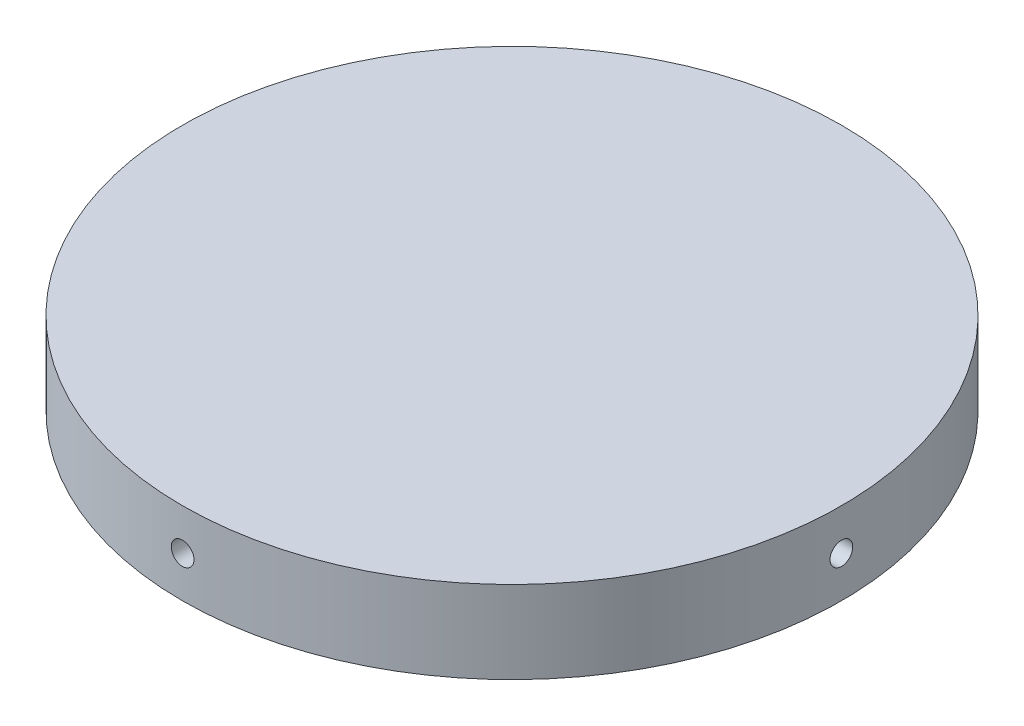
ISO-10303-21;
HEADER;
FILE_DESCRIPTION(('STEP AP214'),'2;1');
FILE_NAME('part.step','',(''),(''),'','','');
FILE_SCHEMA(('AUTOMOTIVE_DESIGN { 1 0 10303 214 1 1 1 1 }'));
ENDSEC;
DATA;
#1=APPLICATION_CONTEXT('core data for automotive mechanical design processes');
#2=APPLICATION_PROTOCOL_DEFINITION('international standard','automotive_design',2000,#1);
#3=PRODUCT_CONTEXT('',#1,'mechanical');
#4=PRODUCT('Part','Part','',(#3));
#5=PRODUCT_RELATED_PRODUCT_CATEGORY('part','',(#4));
#6=PRODUCT_DEFINITION_FORMATION('','',#4);
#7=PRODUCT_DEFINITION_CONTEXT('part definition',#1,'design');
#8=PRODUCT_DEFINITION('design','',#6,#7);
#9=PRODUCT_DEFINITION_SHAPE('','',#8);
#10=(LENGTH_UNIT() NAMED_UNIT(*) SI_UNIT(.MILLI.,.METRE.));
#11=(NAMED_UNIT(*) PLANE_ANGLE_UNIT() SI_UNIT($,.RADIAN.));
#12=(NAMED_UNIT(*) SI_UNIT($,.STERADIAN.) SOLID_ANGLE_UNIT());
#13=UNCERTAINTY_MEASURE_WITH_UNIT(LENGTH_MEASURE(1.E-05),#10,'distance_accuracy_value','');
#14=(GEOMETRIC_REPRESENTATION_CONTEXT(3) GLOBAL_UNCERTAINTY_ASSIGNED_CONTEXT((#13)) GLOBAL_UNIT_ASSIGNED_CONTEXT((#10,
#11,#12)) REPRESENTATION_CONTEXT('',''));
#15=CARTESIAN_POINT('',(0.,0.,0.));
#16=DIRECTION('',(0.,0.,1.));
#17=DIRECTION('',(1.,0.,0.));
#18=AXIS2_PLACEMENT_3D('',#15,#16,#17);
#19=CARTESIAN_POINT('',(0.,12.7,0.));
#20=DIRECTION('',(0.,-1.,0.));
#21=DIRECTION('',(0.,0.,-1.));
#22=AXIS2_PLACEMENT_3D('',#19,#20,#21);
#23=CYLINDRICAL_SURFACE('',#22,50.8);
#24=CARTESIAN_POINT('',(50.7697586486286,6.35,-1.75260000000018));
#25=CARTESIAN_POINT('',(50.7697590563509,6.25158712369945,-1.75259564543816));
#26=CARTESIAN_POINT('',(50.7700478702747,6.15310363437709,-1.74428297929298));
#27=CARTESIAN_POINT('',(50.7711721845594,5.95885109882344,-1.71123866624466));
#28=CARTESIAN_POINT('',(50.7720083363126,5.8630854289641,-1.68648745514505));
#29=CARTESIAN_POINT('',(50.7741324957903,5.67711073668785,-1.6212734359192));
#30=CARTESIAN_POINT('',(50.7754202807472,5.58689900053991,-1.58081837265326));
#31=CARTESIAN_POINT('',(50.778302314984,5.4145721996251,-1.48535627271692));
#32=CARTESIAN_POINT('',(50.7798964898759,5.33245517685738,-1.4303527670313));
#33=CARTESIAN_POINT('',(50.7832127031895,5.17857794030629,-1.30731978963743));
#34=CARTESIAN_POINT('',(50.7849348021763,5.10682268018734,-1.23928412354495));
#35=CARTESIAN_POINT('',(50.7883122209499,4.9757476927813,-1.09212943641594));
#36=CARTESIAN_POINT('',(50.7899675380634,4.91642846294045,-1.01300997223412));
#37=CARTESIAN_POINT('',(50.7930251641414,4.81189972119783,-0.845912742481277));
#38=CARTESIAN_POINT('',(50.7944274146147,4.76669346946469,-0.757932936325698));
#39=CARTESIAN_POINT('',(50.7968203288865,4.69169503014048,-0.575626931287873));
#40=CARTESIAN_POINT('',(50.7978109946004,4.66190277081711,-0.481300761942098));
#41=CARTESIAN_POINT('',(50.7992687193491,4.61858945193518,-0.289019692747369));
#42=CARTESIAN_POINT('',(50.7997359884024,4.60506186584441,-0.191066264685456));
#43=CARTESIAN_POINT('',(50.8000949541903,4.59464177479241,0.00572216138129752));
#44=CARTESIAN_POINT('',(50.7999866536264,4.59774919174994,0.104557155246079));
#45=CARTESIAN_POINT('',(50.7992068664176,4.62050541754115,0.300258946196319));
#46=CARTESIAN_POINT('',(50.798535619427,4.6401471874755,0.397126562852503));
#47=CARTESIAN_POINT('',(50.79670585879,4.69540366652185,0.586188739561539));
#48=CARTESIAN_POINT('',(50.7955473438949,4.73101841656027,0.678383287640246));
#49=CARTESIAN_POINT('',(50.7928731919409,4.81721794986243,0.855504921624031));
#50=CARTESIAN_POINT('',(50.7913574780237,4.86780595550809,0.940430438089782));
#51=CARTESIAN_POINT('',(50.7881397227175,4.9825136079501,1.10058608550572));
#52=CARTESIAN_POINT('',(50.7864376807411,5.04663329740408,1.17581618589063));
#53=CARTESIAN_POINT('',(50.7830380115152,5.18662402673944,1.3144865293823));
#54=CARTESIAN_POINT('',(50.7813403870287,5.262501173579,1.37792060761355));
#55=CARTESIAN_POINT('',(50.7781418359447,5.42383141876462,1.49115077723215));
#56=CARTESIAN_POINT('',(50.7766409093824,5.50928451882575,1.5409468661769));
#57=CARTESIAN_POINT('',(50.774005062609,5.6873444795598,1.62548688040663));
#58=CARTESIAN_POINT('',(50.7728701473992,5.77995143796312,1.66023060001506));
#59=CARTESIAN_POINT('',(50.7710945021759,5.96968874584344,1.71367563160475));
#60=CARTESIAN_POINT('',(50.7704537703865,6.06681907906316,1.73237700123849));
#61=CARTESIAN_POINT('',(50.7697390631889,6.26279230781476,1.75319889347741));
#62=CARTESIAN_POINT('',(50.7696647957442,6.36163429456887,1.75532795982281));
#63=CARTESIAN_POINT('',(50.7700906295787,6.55827218389549,1.74296707929653));
#64=CARTESIAN_POINT('',(50.7705907299688,6.65606808808686,1.72847715814716));
#65=CARTESIAN_POINT('',(50.7721086588272,6.84781386924622,1.68329669707876));
#66=CARTESIAN_POINT('',(50.7731263630513,6.94176466333795,1.65261004490675));
#67=CARTESIAN_POINT('',(50.7755646720241,7.12318147652574,1.57591114524661));
#68=CARTESIAN_POINT('',(50.7769852778606,7.2106474781122,1.52989885637955));
#69=CARTESIAN_POINT('',(50.7800699634245,7.37665120820319,1.42383280209292));
#70=CARTESIAN_POINT('',(50.7817341427782,7.45518525990083,1.36377328505018));
#71=CARTESIAN_POINT('',(50.7851180250531,7.60105885186234,1.23132608217642));
#72=CARTESIAN_POINT('',(50.7868377281547,7.66839835577453,1.15893835631397));
#73=CARTESIAN_POINT('',(50.7901396523594,7.78999987720908,1.00385294890715));
#74=CARTESIAN_POINT('',(50.7917218153481,7.84425638380701,0.921150944877202));
#75=CARTESIAN_POINT('',(50.7945694877666,7.9381140932631,0.747806598646796));
#76=CARTESIAN_POINT('',(50.7958349980311,7.97771533475438,0.657164277378781));
#77=CARTESIAN_POINT('',(50.797906437117,8.04112871529301,0.470533027739396));
#78=CARTESIAN_POINT('',(50.7987124696127,8.06494441631075,0.37454531084691));
#79=CARTESIAN_POINT('',(50.7997745080026,8.09612235280169,0.179930892200068));
#80=CARTESIAN_POINT('',(50.8000305148536,8.10348461689812,0.0813041950369192));
#81=CARTESIAN_POINT('',(50.7999636515915,8.10154629052573,-0.115733551471626));
#82=CARTESIAN_POINT('',(50.7996410827598,8.09225437238121,-0.214144686350581));
#83=CARTESIAN_POINT('',(50.7984540004404,8.05728930389731,-0.408009205743081));
#84=CARTESIAN_POINT('',(50.7975894858873,8.03161612135555,-0.503462584441867));
#85=CARTESIAN_POINT('',(50.795415868083,7.9646186839361,-0.688704831817265));
#86=CARTESIAN_POINT('',(50.7941067579118,7.92329418544868,-0.778493612300114));
#87=CARTESIAN_POINT('',(50.7911914024654,7.82616959827039,-0.949857530207175));
#88=CARTESIAN_POINT('',(50.7895851676408,7.77037001866973,-1.03143295635594));
#89=CARTESIAN_POINT('',(50.7862556251448,7.64585158366056,-1.18409570495988));
#90=CARTESIAN_POINT('',(50.7845322692961,7.57712739097823,-1.25517867278727));
#91=CARTESIAN_POINT('',(50.7811628093207,7.42870084094923,-1.38481814627652));
#92=CARTESIAN_POINT('',(50.7795167244055,7.34899577264919,-1.44337154950296));
#93=CARTESIAN_POINT('',(50.776486775378,7.18083314968626,-1.54630287522696));
#94=CARTESIAN_POINT('',(50.7751030967528,7.09236947056442,-1.59067078551648));
#95=CARTESIAN_POINT('',(50.7727572810387,6.90931187956018,-1.66387261434713));
#96=CARTESIAN_POINT('',(50.7717946423914,6.81472541648413,-1.69272502498622));
#97=CARTESIAN_POINT('',(50.7706563408481,6.65795268143263,-1.72644481694736));
#98=CARTESIAN_POINT('',(50.7703211727805,6.59678362086623,-1.73624063654658));
#99=CARTESIAN_POINT('',(50.7698721985096,6.47375234900876,-1.74931959604606));
#100=CARTESIAN_POINT('',(50.7697583922192,6.41189013799036,-1.75260273850813));
#101=CARTESIAN_POINT('',(50.7697586486286,6.35,-1.75260000000018));
#102=B_SPLINE_CURVE_WITH_KNOTS('',3,(#24,#25,#26,#27,#28,#29,#30,#31,#32,#33,#34,#35,#36,#37,
#38,#39,#40,#41,#42,#43,#44,#45,#46,#47,#48,#49,#50,#51,#52,#53,#54,#55,#56,#57,#58,#59,#60,#61,
#62,#63,#64,#65,#66,#67,#68,#69,#70,#71,#72,#73,#74,#75,#76,#77,#78,#79,#80,#81,#82,#83,#84,#85,
#86,#87,#88,#89,#90,#91,#92,#93,#94,#95,#96,#97,#98,#99,#100,#101),.UNSPECIFIED.,.T.,.F.,(4,2,2,
2,2,2,2,2,2,2,2,2,2,2,2,2,2,2,2,2,2,2,2,2,2,2,2,2,2,2,2,2,2,2,2,2,2,2,4),(0.,0.295012718980966,
0.590377175561222,0.88559614834363,1.1807435355453,1.47603156047932,1.77133139480085,
2.06669939447319,2.36206601957486,2.65731408318958,2.95256076097259,3.24768181174946,
3.54280361869841,3.83798898480409,4.13317528147352,4.42851541843866,4.72385560830018,
5.01919983358211,5.31454299746121,5.60973388905447,5.90492432376197,6.20004393527856,
6.49516434361926,6.79040580090399,7.08564821689796,7.38101478085389,7.67638056618114,
7.97167968019765,8.26697828049624,8.56212315476916,8.85726860924116,9.15241865778436,
9.44755832727452,9.74282014463666,10.0381549871587,10.3336978210068,10.6288876279762,
10.8144160441254,10.9999443872955),.UNSPECIFIED.);
#103=CARTESIAN_POINT('',(50.7697586486286,6.35,-1.75260000000018));
#104=VERTEX_POINT('',#103);
#105=EDGE_CURVE('E10',#104,#104,#102,.T.);
#106=ORIENTED_EDGE('',*,*,#105,.T.);
#107=EDGE_LOOP('',(#106));
#108=FACE_BOUND('',#107,.T.);
#109=CARTESIAN_POINT('',(0.,8.1026,-50.8));
#110=CARTESIAN_POINT('',(-0.0984128959565782,8.10259564545586,-50.7999995931979));
#111=CARTESIAN_POINT('',(-0.196896404867266,8.09428297610245,-50.799710955742));
#112=CARTESIAN_POINT('',(-0.391148981122014,8.06123864915159,-50.7985872715938));
#113=CARTESIAN_POINT('',(-0.48691467210945,8.036487427424,-50.7977515738417));
#114=CARTESIAN_POINT('',(-0.672889409044617,7.97127337710194,-50.7956283999256));
#115=CARTESIAN_POINT('',(-0.763101168544404,7.93081829286039,-50.7943411464762));
#116=CARTESIAN_POINT('',(-0.935428008517312,7.83535614354203,-50.7914600199745));
#117=CARTESIAN_POINT('',(-1.01754504702097,7.78035260950216,-50.7898662213488));
#118=CARTESIAN_POINT('',(-1.1714222655228,7.65731960358333,-50.7865504417537));
#119=CARTESIAN_POINT('',(-1.2431774969079,7.58928394364306,-50.7848284001287));
#120=CARTESIAN_POINT('',(-1.37425242893701,7.44212928084566,-50.7814507509568));
#121=CARTESIAN_POINT('',(-1.4335716320468,7.36300983476529,-50.77979514607));
#122=CARTESIAN_POINT('',(-1.538100346055,7.19591262059332,-50.7767367249013));
#123=CARTESIAN_POINT('',(-1.58330659181438,7.10793280880709,-50.7753339671492));
#124=CARTESIAN_POINT('',(-1.65830501853675,6.92562679152479,-50.7729400417122));
#125=CARTESIAN_POINT('',(-1.68809727130477,6.83130061559515,-50.77194887211));
#126=CARTESIAN_POINT('',(-1.73141057616485,6.63901952737372,-50.7704903642857));
#127=CARTESIAN_POINT('',(-1.74493815432662,6.54106608676581,-50.77002281597));
#128=CARTESIAN_POINT('',(-1.75535822517484,6.34427763621804,-50.7696636384962));
#129=CARTESIAN_POINT('',(-1.75225079602588,6.24544263042267,-50.7697720066319));
#130=CARTESIAN_POINT('',(-1.72949455116915,6.04974089387287,-50.7705522460495));
#131=CARTESIAN_POINT('',(-1.70985278662663,5.95287334211728,-50.771223877124));
#132=CARTESIAN_POINT('',(-1.65459634095298,5.76381129243322,-50.7730545539207));
#133=CARTESIAN_POINT('',(-1.61898161877555,5.67161680651399,-50.7742136008955));
#134=CARTESIAN_POINT('',(-1.53278214267062,5.49449524695994,-50.7768887327971));
#135=CARTESIAN_POINT('',(-1.48219415977972,5.40956974596971,-50.7784048947208));
#136=CARTESIAN_POINT('',(-1.36748655564144,5.24941411980763,-50.78162326513));
#137=CARTESIAN_POINT('',(-1.3033668917511,5.17418402519053,-50.7833254742018));
#138=CARTESIAN_POINT('',(-1.1633761802604,5.03551365194251,-50.7867251244156));
#139=CARTESIAN_POINT('',(-1.08749902055746,4.97207954337325,-50.7884225626076));
#140=CARTESIAN_POINT('',(-0.926168738931161,4.85884931871537,-50.791620468291));
#141=CARTESIAN_POINT('',(-0.840715615335229,4.80905320500883,-50.7931209357481));
#142=CARTESIAN_POINT('',(-0.662655648845048,4.72451317306927,-50.7957557921781));
#143=CARTESIAN_POINT('',(-0.5700487119044,4.68976945275971,-50.7968901763374));
#144=CARTESIAN_POINT('',(-0.380311450581766,4.63632441316367,-50.7986649211309));
#145=CARTESIAN_POINT('',(-0.283181142421377,4.61762303635123,-50.7993052835366));
#146=CARTESIAN_POINT('',(-0.0872079243355516,4.59680111713785,-50.8000195761506));
#147=CARTESIAN_POINT('',(0.0116340775398622,4.5946720378379,-50.8000937979947));
#148=CARTESIAN_POINT('',(0.20827200024276,4.60703289785515,-50.7996682160819));
#149=CARTESIAN_POINT('',(0.306067922689191,4.62152281144849,-50.7991684132135));
#150=CARTESIAN_POINT('',(0.497813789647892,4.66670327559961,-50.7976512918862));
#151=CARTESIAN_POINT('',(0.591764649486023,4.69738994602561,-50.7966340973771));
#152=CARTESIAN_POINT('',(0.773181586062896,4.77408890427423,-50.7941967968346));
#153=CARTESIAN_POINT('',(0.860647645337104,4.82010123336929,-50.7927766897161));
#154=CARTESIAN_POINT('',(1.02665141320237,4.92616734599295,-50.7896927736392));
#155=CARTESIAN_POINT('',(1.10518545152865,4.98622687090682,-50.788028865138));
#156=CARTESIAN_POINT('',(1.25105901283208,5.11867408201043,-50.7846451768049));
#157=CARTESIAN_POINT('',(1.31839849940078,5.1910618082941,-50.7829253967913));
#158=CARTESIAN_POINT('',(1.43999998553517,5.34614720782146,-50.7796230047163));
#159=CARTESIAN_POINT('',(1.49425647418964,5.42884920353655,-50.7780404506373));
#160=CARTESIAN_POINT('',(1.58811415211509,5.60219352855812,-50.775191853083));
#161=CARTESIAN_POINT('',(1.62771538001911,5.6928358369322,-50.7739258087735));
#162=CARTESIAN_POINT('',(1.69112875107789,5.87946709648122,-50.7718533926797));
#163=CARTESIAN_POINT('',(1.71494445033061,5.97545483817391,-50.7710469173715));
#164=CARTESIAN_POINT('',(1.74612237488034,6.17006930894842,-50.7699842791192));
#165=CARTESIAN_POINT('',(1.75348462893165,6.268696033418,-50.7697281152135));
#166=CARTESIAN_POINT('',(1.75154627419168,6.46573376092397,-50.7697950192215));
#167=CARTESIAN_POINT('',(1.74225434965268,6.5641448496131,-50.7701177852547));
#168=CARTESIAN_POINT('',(1.70728928467348,6.75800927508585,-50.7713055292118));
#169=CARTESIAN_POINT('',(1.68161611194781,6.8534626060397,-50.7721705082042));
#170=CARTESIAN_POINT('',(1.61461871113359,7.03870476103204,-50.7743451188269));
#171=CARTESIAN_POINT('',(1.57329423938889,7.12849349685992,-50.7756547573795));
#172=CARTESIAN_POINT('',(1.47616971944185,7.29985733668389,-50.7785710019698));
#173=CARTESIAN_POINT('',(1.42037018028169,7.38143272937719,-50.7801775975638));
#174=CARTESIAN_POINT('',(1.29585178871437,7.53409548241012,-50.7835075374625));
#175=CARTESIAN_POINT('',(1.22712758986066,7.60517848064278,-50.7852309298923));
#176=CARTESIAN_POINT('',(1.07870101512548,7.73481801258338,-50.7886001214114));
#177=CARTESIAN_POINT('',(0.998995928356096,7.79337144393392,-50.790245901205));
#178=CARTESIAN_POINT('',(0.830833291411807,7.89630279875081,-50.7932750311959));
#179=CARTESIAN_POINT('',(0.742369620058934,7.94067071537748,-50.7946581958595));
#180=CARTESIAN_POINT('',(0.559312045732336,8.0138725582322,-50.797003001926));
#181=CARTESIAN_POINT('',(0.464725591522505,8.04272497645661,-50.7979651448636));
#182=CARTESIAN_POINT('',(0.307952836064301,8.07644479054058,-50.7991028291222));
#183=CARTESIAN_POINT('',(0.246783744663286,8.08624062007191,-50.7994378050103));
#184=CARTESIAN_POINT('',(0.12375241098076,8.09931959277201,-50.7998865183212));
#185=CARTESIAN_POINT('',(0.0618901689713733,8.10260273849753,-50.8000002558308));
#186=CARTESIAN_POINT('',(0.,8.1026,-50.8));
#187=B_SPLINE_CURVE_WITH_KNOTS('',3,(#109,#110,#111,#112,#113,#114,#115,#116,#117,#118,#119,
#120,#121,#122,#123,#124,#125,#126,#127,#128,#129,#130,#131,#132,#133,#134,#135,#136,#137,#138,
#139,#140,#141,#142,#143,#144,#145,#146,#147,#148,#149,#150,#151,#152,#153,#154,#155,#156,#157,
#158,#159,#160,#161,#162,#163,#164,#165,#166,#167,#168,#169,#170,#171,#172,#173,#174,#175,#176,
#177,#178,#179,#180,#181,#182,#183,#184,#185,#186),.UNSPECIFIED.,.T.,.F.,(4,2,2,2,2,2,2,2,2,2,2,
2,2,2,2,2,2,2,2,2,2,2,2,2,2,2,2,2,2,2,2,2,2,2,2,2,2,2,4),(0.,0.295012778010638,0.59037729233706,
0.885596332451623,1.18074378594895,1.47603173366953,1.77133149286483,2.06669952134063,
2.36206617385231,2.65731427328077,2.95256098539832,3.24768185155589,3.54280347610102,
3.83798878965154,4.13317503344603,4.42851524703345,4.72385551220625,5.019199660681,
5.31454275008169,5.60973368911843,5.90492417124168,6.20004396893928,6.49516456140956,
6.79040598733273,7.08564837346162,7.38101490723678,7.6763806623843,7.9716798561328,
8.26697853381107,8.56212327401551,8.85726859591654,9.15241851276689,9.44755805153782,
9.74281994807331,10.0381548679406,10.3336976675934,10.6288874423235,10.8144159512669,
10.999944387376),.UNSPECIFIED.);
#188=CARTESIAN_POINT('',(0.,8.1026,-50.8));
#189=VERTEX_POINT('',#188);
#190=EDGE_CURVE('E48',#189,#189,#187,.T.);
#191=ORIENTED_EDGE('',*,*,#190,.T.);
#192=EDGE_LOOP('',(#191));
#193=FACE_BOUND('',#192,.T.);
#194=CARTESIAN_POINT('',(-50.7697586486286,6.35,1.75260000000053));
#195=CARTESIAN_POINT('',(-50.7697590563509,6.25158712369945,1.75259564543851));
#196=CARTESIAN_POINT('',(-50.7700478702747,6.15310363437709,1.74428297929334));
#197=CARTESIAN_POINT('',(-50.7711721845594,5.95885109882344,1.71123866624502));
#198=CARTESIAN_POINT('',(-50.7720083363126,5.8630854289641,1.68648745514541));
#199=CARTESIAN_POINT('',(-50.7741324957903,5.67711073668785,1.62127343591955));
#200=CARTESIAN_POINT('',(-50.7754202807472,5.58689900053991,1.58081837265361));
#201=CARTESIAN_POINT('',(-50.778302314984,5.4145721996251,1.48535627271727));
#202=CARTESIAN_POINT('',(-50.7798964898759,5.33245517685738,1.43035276703165));
#203=CARTESIAN_POINT('',(-50.7832127031895,5.17857794030629,1.30731978963779));
#204=CARTESIAN_POINT('',(-50.7849348021762,5.10682268018734,1.2392841235453));
#205=CARTESIAN_POINT('',(-50.7883122209499,4.9757476927813,1.0921294364163));
#206=CARTESIAN_POINT('',(-50.7899675380634,4.91642846294045,1.01300997223447));
#207=CARTESIAN_POINT('',(-50.7930251641414,4.81189972119783,0.845912742481632));
#208=CARTESIAN_POINT('',(-50.7944274146147,4.76669346946469,0.757932936326053));
#209=CARTESIAN_POINT('',(-50.7968203288865,4.69169503014048,0.575626931288229));
#210=CARTESIAN_POINT('',(-50.7978109946004,4.66190277081711,0.481300761942454));
#211=CARTESIAN_POINT('',(-50.7992687193491,4.61858945193518,0.289019692747725));
#212=CARTESIAN_POINT('',(-50.7997359884024,4.60506186584441,0.191066264685812));
#213=CARTESIAN_POINT('',(-50.8000949541903,4.59464177479241,-0.00572216138094226));
#214=CARTESIAN_POINT('',(-50.7999866536264,4.59774919174994,-0.104557155245724));
#215=CARTESIAN_POINT('',(-50.7992068664176,4.62050541754115,-0.300258946195964));
#216=CARTESIAN_POINT('',(-50.798535619427,4.6401471874755,-0.397126562852148));
#217=CARTESIAN_POINT('',(-50.79670585879,4.69540366652185,-0.586188739561184));
#218=CARTESIAN_POINT('',(-50.7955473438949,4.73101841656027,-0.678383287639891));
#219=CARTESIAN_POINT('',(-50.7928731919409,4.81721794986243,-0.855504921623675));
#220=CARTESIAN_POINT('',(-50.7913574780237,4.86780595550809,-0.940430438089427));
#221=CARTESIAN_POINT('',(-50.7881397227175,4.9825136079501,-1.10058608550537));
#222=CARTESIAN_POINT('',(-50.7864376807411,5.04663329740408,-1.17581618589027));
#223=CARTESIAN_POINT('',(-50.7830380115152,5.18662402673944,-1.31448652938195));
#224=CARTESIAN_POINT('',(-50.7813403870287,5.262501173579,-1.37792060761319));
#225=CARTESIAN_POINT('',(-50.7781418359447,5.42383141876462,-1.4911507772318));
#226=CARTESIAN_POINT('',(-50.7766409093824,5.50928451882575,-1.54094686617655));
#227=CARTESIAN_POINT('',(-50.7740050626091,5.68734447955979,-1.62548688040628));
#228=CARTESIAN_POINT('',(-50.7728701473992,5.77995143796312,-1.6602306000147));
#229=CARTESIAN_POINT('',(-50.771094502176,5.96968874584345,-1.7136756316044));
#230=CARTESIAN_POINT('',(-50.7704537703865,6.06681907906316,-1.73237700123814));
#231=CARTESIAN_POINT('',(-50.7697390631889,6.26279230781476,-1.75319889347706));
#232=CARTESIAN_POINT('',(-50.7696647957442,6.36163429456886,-1.75532795982245));
#233=CARTESIAN_POINT('',(-50.7700906295787,6.55827218389549,-1.74296707929618));
#234=CARTESIAN_POINT('',(-50.7705907299688,6.65606808808686,-1.72847715814681));
#235=CARTESIAN_POINT('',(-50.7721086588272,6.84781386924622,-1.68329669707841));
#236=CARTESIAN_POINT('',(-50.7731263630513,6.94176466333795,-1.65261004490639));
#237=CARTESIAN_POINT('',(-50.7755646720241,7.12318147652574,-1.57591114524626));
#238=CARTESIAN_POINT('',(-50.7769852778606,7.2106474781122,-1.5298988563792));
#239=CARTESIAN_POINT('',(-50.7800699634245,7.37665120820319,-1.42383280209257));
#240=CARTESIAN_POINT('',(-50.7817341427782,7.45518525990083,-1.36377328504982));
#241=CARTESIAN_POINT('',(-50.7851180250531,7.60105885186234,-1.23132608217607));
#242=CARTESIAN_POINT('',(-50.7868377281547,7.66839835577453,-1.15893835631361));
#243=CARTESIAN_POINT('',(-50.7901396523595,7.78999987720908,-1.00385294890679));
#244=CARTESIAN_POINT('',(-50.7917218153481,7.84425638380701,-0.921150944876847));
#245=CARTESIAN_POINT('',(-50.7945694877666,7.9381140932631,-0.747806598646442));
#246=CARTESIAN_POINT('',(-50.7958349980311,7.97771533475438,-0.657164277378426));
#247=CARTESIAN_POINT('',(-50.797906437117,8.04112871529301,-0.470533027739042));
#248=CARTESIAN_POINT('',(-50.7987124696127,8.06494441631075,-0.374545310846556));
#249=CARTESIAN_POINT('',(-50.7997745080026,8.09612235280169,-0.179930892199714));
#250=CARTESIAN_POINT('',(-50.8000305148536,8.10348461689812,-0.0813041950365646));
#251=CARTESIAN_POINT('',(-50.7999636515915,8.10154629052573,0.115733551471981));
#252=CARTESIAN_POINT('',(-50.7996410827598,8.09225437238121,0.214144686350936));
#253=CARTESIAN_POINT('',(-50.7984540004404,8.05728930389731,0.408009205743436));
#254=CARTESIAN_POINT('',(-50.7975894858873,8.03161612135555,0.503462584442222));
#255=CARTESIAN_POINT('',(-50.795415868083,7.9646186839361,0.68870483181762));
#256=CARTESIAN_POINT('',(-50.7941067579118,7.92329418544868,0.77849361230047));
#257=CARTESIAN_POINT('',(-50.7911914024654,7.82616959827039,0.949857530207531));
#258=CARTESIAN_POINT('',(-50.7895851676408,7.77037001866973,1.03143295635629));
#259=CARTESIAN_POINT('',(-50.7862556251447,7.64585158366056,1.18409570496023));
#260=CARTESIAN_POINT('',(-50.7845322692961,7.57712739097823,1.25517867278762));
#261=CARTESIAN_POINT('',(-50.7811628093207,7.42870084094923,1.38481814627688));
#262=CARTESIAN_POINT('',(-50.7795167244055,7.34899577264919,1.44337154950332));
#263=CARTESIAN_POINT('',(-50.776486775378,7.18083314968625,1.54630287522732));
#264=CARTESIAN_POINT('',(-50.7751030967528,7.09236947056442,1.59067078551684));
#265=CARTESIAN_POINT('',(-50.7727572810387,6.90931187956018,1.66387261434748));
#266=CARTESIAN_POINT('',(-50.7717946423914,6.81472541648413,1.69272502498658));
#267=CARTESIAN_POINT('',(-50.7706563408481,6.65795268143263,1.72644481694771));
#268=CARTESIAN_POINT('',(-50.7703211727805,6.59678362086623,1.73624063654694));
#269=CARTESIAN_POINT('',(-50.7698721985095,6.47375234900876,1.74931959604641));
#270=CARTESIAN_POINT('',(-50.7697583922192,6.41189013799036,1.75260273850848));
#271=CARTESIAN_POINT('',(-50.7697586486286,6.35,1.75260000000053));
#272=B_SPLINE_CURVE_WITH_KNOTS('',3,(#194,#195,#196,#197,#198,#199,#200,#201,#202,#203,#204,
#205,#206,#207,#208,#209,#210,#211,#212,#213,#214,#215,#216,#217,#218,#219,#220,#221,#222,#223,
#224,#225,#226,#227,#228,#229,#230,#231,#232,#233,#234,#235,#236,#237,#238,#239,#240,#241,#242,
#243,#244,#245,#246,#247,#248,#249,#250,#251,#252,#253,#254,#255,#256,#257,#258,#259,#260,#261,
#262,#263,#264,#265,#266,#267,#268,#269,#270,#271),.UNSPECIFIED.,.T.,.F.,(4,2,2,2,2,2,2,2,2,2,2,
2,2,2,2,2,2,2,2,2,2,2,2,2,2,2,2,2,2,2,2,2,2,2,2,2,2,2,4),(0.,0.295012718980966,
0.590377175561222,0.88559614834363,1.1807435355453,1.47603156047932,1.77133139480085,
2.06669939447318,2.36206601957486,2.65731408318958,2.95256076097259,3.24768181174946,
3.54280361869841,3.83798898480409,4.13317528147352,4.42851541843866,4.72385560830018,
5.01919983358211,5.31454299746121,5.60973388905447,5.90492432376197,6.20004393527857,
6.49516434361926,6.79040580090399,7.08564821689796,7.38101478085389,7.67638056618114,
7.97167968019765,8.26697828049624,8.56212315476916,8.85726860924117,9.15241865778437,
9.44755832727452,9.74282014463666,10.0381549871587,10.3336978210068,10.6288876279762,
10.8144160441254,10.9999443872955),.UNSPECIFIED.);
#273=CARTESIAN_POINT('',(-50.7697586486286,6.35,1.75260000000053));
#274=VERTEX_POINT('',#273);
#275=EDGE_CURVE('E53',#274,#274,#272,.T.);
#276=ORIENTED_EDGE('',*,*,#275,.T.);
#277=EDGE_LOOP('',(#276));
#278=FACE_BOUND('',#277,.T.);
#279=CARTESIAN_POINT('',(1.7526,6.35,50.7697586486286));
#280=CARTESIAN_POINT('',(1.75259564543798,6.25158712369945,50.7697590563509));
#281=CARTESIAN_POINT('',(1.7442829792928,6.15310363437709,50.7700478702747));
#282=CARTESIAN_POINT('',(1.71123866624449,5.95885109882344,50.7711721845594));
#283=CARTESIAN_POINT('',(1.68648745514488,5.8630854289641,50.7720083363126));
#284=CARTESIAN_POINT('',(1.62127343591902,5.67711073668785,50.7741324957903));
#285=CARTESIAN_POINT('',(1.58081837265308,5.58689900053991,50.7754202807472));
#286=CARTESIAN_POINT('',(1.48535627271674,5.4145721996251,50.778302314984));
#287=CARTESIAN_POINT('',(1.43035276703112,5.33245517685738,50.7798964898759));
#288=CARTESIAN_POINT('',(1.30731978963726,5.17857794030629,50.7832127031895));
#289=CARTESIAN_POINT('',(1.23928412354477,5.10682268018734,50.7849348021763));
#290=CARTESIAN_POINT('',(1.09212943641576,4.9757476927813,50.7883122209499));
#291=CARTESIAN_POINT('',(1.01300997223394,4.91642846294045,50.7899675380634));
#292=CARTESIAN_POINT('',(0.8459127424811,4.81189972119783,50.7930251641414));
#293=CARTESIAN_POINT('',(0.757932936325521,4.76669346946469,50.7944274146147));
#294=CARTESIAN_POINT('',(0.575626931287697,4.69169503014048,50.7968203288866));
#295=CARTESIAN_POINT('',(0.481300761941922,4.66190277081711,50.7978109946004));
#296=CARTESIAN_POINT('',(0.289019692747193,4.61858945193518,50.7992687193491));
#297=CARTESIAN_POINT('',(0.19106626468528,4.60506186584441,50.7997359884024));
#298=CARTESIAN_POINT('',(-0.00572216138147425,4.59464177479241,50.8000949541903));
#299=CARTESIAN_POINT('',(-0.104557155246256,4.59774919174994,50.7999866536264));
#300=CARTESIAN_POINT('',(-0.300258946196496,4.62050541754115,50.7992068664176));
#301=CARTESIAN_POINT('',(-0.39712656285268,4.6401471874755,50.798535619427));
#302=CARTESIAN_POINT('',(-0.586188739561716,4.69540366652185,50.79670585879));
#303=CARTESIAN_POINT('',(-0.678383287640423,4.73101841656027,50.7955473438949));
#304=CARTESIAN_POINT('',(-0.855504921624207,4.81721794986243,50.7928731919409));
#305=CARTESIAN_POINT('',(-0.940430438089959,4.86780595550809,50.7913574780237));
#306=CARTESIAN_POINT('',(-1.1005860855059,4.9825136079501,50.7881397227175));
#307=CARTESIAN_POINT('',(-1.17581618589081,5.04663329740408,50.7864376807411));
#308=CARTESIAN_POINT('',(-1.31448652938248,5.18662402673944,50.7830380115152));
#309=CARTESIAN_POINT('',(-1.37792060761372,5.262501173579,50.7813403870287));
#310=CARTESIAN_POINT('',(-1.49115077723233,5.42383141876462,50.7781418359447));
#311=CARTESIAN_POINT('',(-1.54094686617708,5.50928451882575,50.7766409093824));
#312=CARTESIAN_POINT('',(-1.62548688040681,5.68734447955979,50.774005062609));
#313=CARTESIAN_POINT('',(-1.66023060001523,5.77995143796312,50.7728701473992));
#314=CARTESIAN_POINT('',(-1.71367563160493,5.96968874584344,50.7710945021759));
#315=CARTESIAN_POINT('',(-1.73237700123867,6.06681907906316,50.7704537703865));
#316=CARTESIAN_POINT('',(-1.75319889347759,6.26279230781476,50.7697390631889));
#317=CARTESIAN_POINT('',(-1.75532795982299,6.36163429456886,50.7696647957442));
#318=CARTESIAN_POINT('',(-1.74296707929671,6.55827218389549,50.7700906295786));
#319=CARTESIAN_POINT('',(-1.72847715814734,6.65606808808686,50.7705907299688));
#320=CARTESIAN_POINT('',(-1.68329669707894,6.84781386924622,50.7721086588272));
#321=CARTESIAN_POINT('',(-1.65261004490692,6.94176466333795,50.7731263630513));
#322=CARTESIAN_POINT('',(-1.57591114524679,7.12318147652574,50.7755646720241));
#323=CARTESIAN_POINT('',(-1.52989885637973,7.2106474781122,50.7769852778606));
#324=CARTESIAN_POINT('',(-1.4238328020931,7.37665120820319,50.7800699634245));
#325=CARTESIAN_POINT('',(-1.36377328505036,7.45518525990083,50.7817341427782));
#326=CARTESIAN_POINT('',(-1.2313260821766,7.60105885186234,50.7851180250531));
#327=CARTESIAN_POINT('',(-1.15893835631414,7.66839835577453,50.7868377281547));
#328=CARTESIAN_POINT('',(-1.00385294890732,7.78999987720908,50.7901396523594));
#329=CARTESIAN_POINT('',(-0.92115094487738,7.84425638380701,50.7917218153481));
#330=CARTESIAN_POINT('',(-0.747806598646974,7.9381140932631,50.7945694877666));
#331=CARTESIAN_POINT('',(-0.657164277378959,7.97771533475438,50.7958349980311));
#332=CARTESIAN_POINT('',(-0.470533027739575,8.04112871529301,50.797906437117));
#333=CARTESIAN_POINT('',(-0.374545310847089,8.06494441631075,50.7987124696127));
#334=CARTESIAN_POINT('',(-0.179930892200247,8.09612235280169,50.7997745080026));
#335=CARTESIAN_POINT('',(-0.0813041950370974,8.10348461689812,50.8000305148536));
#336=CARTESIAN_POINT('',(0.115733551471448,8.10154629052573,50.7999636515915));
#337=CARTESIAN_POINT('',(0.214144686350403,8.09225437238121,50.7996410827598));
#338=CARTESIAN_POINT('',(0.408009205742904,8.05728930389731,50.7984540004404));
#339=CARTESIAN_POINT('',(0.503462584441689,8.03161612135555,50.7975894858873));
#340=CARTESIAN_POINT('',(0.688704831817088,7.9646186839361,50.795415868083));
#341=CARTESIAN_POINT('',(0.778493612299937,7.92329418544868,50.7941067579118));
#342=CARTESIAN_POINT('',(0.949857530206998,7.82616959827039,50.7911914024654));
#343=CARTESIAN_POINT('',(1.03143295635576,7.77037001866973,50.7895851676408));
#344=CARTESIAN_POINT('',(1.1840957049597,7.64585158366056,50.7862556251448));
#345=CARTESIAN_POINT('',(1.25517867278709,7.57712739097823,50.7845322692961));
#346=CARTESIAN_POINT('',(1.38481814627634,7.42870084094923,50.7811628093207));
#347=CARTESIAN_POINT('',(1.44337154950278,7.34899577264919,50.7795167244055));
#348=CARTESIAN_POINT('',(1.54630287522678,7.18083314968626,50.776486775378));
#349=CARTESIAN_POINT('',(1.59067078551631,7.09236947056442,50.7751030967528));
#350=CARTESIAN_POINT('',(1.66387261434695,6.90931187956018,50.7727572810387));
#351=CARTESIAN_POINT('',(1.69272502498604,6.81472541648413,50.7717946423914));
#352=CARTESIAN_POINT('',(1.72644481694718,6.65795268143263,50.7706563408481));
#353=CARTESIAN_POINT('',(1.73624063654641,6.59678362086623,50.7703211727805));
#354=CARTESIAN_POINT('',(1.74931959604588,6.47375234900876,50.7698721985096));
#355=CARTESIAN_POINT('',(1.75260273850795,6.41189013799036,50.7697583922192));
#356=CARTESIAN_POINT('',(1.7526,6.35,50.7697586486286));
#357=B_SPLINE_CURVE_WITH_KNOTS('',3,(#279,#280,#281,#282,#283,#284,#285,#286,#287,#288,#289,
#290,#291,#292,#293,#294,#295,#296,#297,#298,#299,#300,#301,#302,#303,#304,#305,#306,#307,#308,
#309,#310,#311,#312,#313,#314,#315,#316,#317,#318,#319,#320,#321,#322,#323,#324,#325,#326,#327,
#328,#329,#330,#331,#332,#333,#334,#335,#336,#337,#338,#339,#340,#341,#342,#343,#344,#345,#346,
#347,#348,#349,#350,#351,#352,#353,#354,#355,#356),.UNSPECIFIED.,.T.,.F.,(4,2,2,2,2,2,2,2,2,2,2,
2,2,2,2,2,2,2,2,2,2,2,2,2,2,2,2,2,2,2,2,2,2,2,2,2,2,2,4),(0.,0.295012718980966,
0.590377175561222,0.88559614834363,1.1807435355453,1.47603156047932,1.77133139480085,
2.06669939447318,2.36206601957486,2.65731408318958,2.95256076097259,3.24768181174946,
3.54280361869841,3.83798898480409,4.13317528147352,4.42851541843866,4.72385560830018,
5.01919983358211,5.31454299746121,5.60973388905447,5.90492432376197,6.20004393527857,
6.49516434361926,6.79040580090399,7.08564821689796,7.38101478085389,7.67638056618114,
7.97167968019765,8.26697828049624,8.56212315476916,8.85726860924117,9.15241865778437,
9.44755832727452,9.74282014463666,10.0381549871587,10.3336978210068,10.6288876279762,
10.8144160441254,10.9999443872955),.UNSPECIFIED.);
#358=CARTESIAN_POINT('',(1.7526,6.35,50.7697586486286));
#359=VERTEX_POINT('',#358);
#360=EDGE_CURVE('E58',#359,#359,#357,.T.);
#361=ORIENTED_EDGE('',*,*,#360,.T.);
#362=EDGE_LOOP('',(#361));
#363=FACE_BOUND('',#362,.T.);
#364=CARTESIAN_POINT('',(0.,12.7,0.));
#365=DIRECTION('',(0.,1.,0.));
#366=DIRECTION('',(0.,0.,1.));
#367=AXIS2_PLACEMENT_3D('',#364,#365,#366);
#368=CIRCLE('',#367,50.8);
#369=CARTESIAN_POINT('',(0.,12.7,50.8));
#370=VERTEX_POINT('',#369);
#371=EDGE_CURVE('E101',#370,#370,#368,.T.);
#372=ORIENTED_EDGE('',*,*,#371,.F.);
#373=EDGE_LOOP('',(#372));
#374=FACE_BOUND('',#373,.T.);
#375=CARTESIAN_POINT('',(0.,0.,0.));
#376=DIRECTION('',(0.,1.,0.));
#377=DIRECTION('',(0.,0.,1.));
#378=AXIS2_PLACEMENT_3D('',#375,#376,#377);
#379=CIRCLE('',#378,50.8);
#380=CARTESIAN_POINT('',(0.,0.,50.8));
#381=VERTEX_POINT('',#380);
#382=EDGE_CURVE('E102',#381,#381,#379,.T.);
#383=ORIENTED_EDGE('',*,*,#382,.T.);
#384=EDGE_LOOP('',(#383));
#385=FACE_BOUND('',#384,.T.);
#386=ADVANCED_FACE('F36',(#108,#193,#278,#363,#374,#385),#23,.T.);
#387=CARTESIAN_POINT('',(0.,12.7,0.));
#388=DIRECTION('',(0.,1.,0.));
#389=DIRECTION('',(0.,0.,1.));
#390=AXIS2_PLACEMENT_3D('',#387,#388,#389);
#391=PLANE('',#390);
#392=ORIENTED_EDGE('',*,*,#371,.T.);
#393=EDGE_LOOP('',(#392));
#394=FACE_BOUND('',#393,.T.);
#395=ADVANCED_FACE('F94',(#394),#391,.T.);
#396=CARTESIAN_POINT('',(0.,0.,0.));
#397=DIRECTION('',(0.,1.,0.));
#398=DIRECTION('',(0.,0.,1.));
#399=AXIS2_PLACEMENT_3D('',#396,#397,#398);
#400=PLANE('',#399);
#401=ORIENTED_EDGE('',*,*,#382,.F.);
#402=EDGE_LOOP('',(#401));
#403=FACE_BOUND('',#402,.T.);
#404=ADVANCED_FACE('F92',(#403),#400,.F.);
#405=CARTESIAN_POINT('',(0.,6.35,31.75));
#406=DIRECTION('',(0.,0.,1.));
#407=DIRECTION('',(1.,0.,0.));
#408=AXIS2_PLACEMENT_3D('',#405,#406,#407);
#409=CYLINDRICAL_SURFACE('',#408,1.7526);
#410=CARTESIAN_POINT('',(0.,6.35,31.75));
#411=DIRECTION('',(0.,0.,1.));
#412=DIRECTION('',(1.,0.,0.));
#413=AXIS2_PLACEMENT_3D('',#410,#411,#412);
#414=CIRCLE('',#413,1.7526);
#415=CARTESIAN_POINT('',(1.7526,6.35,31.75));
#416=VERTEX_POINT('',#415);
#417=EDGE_CURVE('E106',#416,#416,#414,.T.);
#418=ORIENTED_EDGE('',*,*,#417,.F.);
#419=EDGE_LOOP('',(#418));
#420=FACE_BOUND('',#419,.T.);
#421=ORIENTED_EDGE('',*,*,#360,.F.);
#422=EDGE_LOOP('',(#421));
#423=FACE_BOUND('',#422,.T.);
#424=ADVANCED_FACE('F87',(#420,#423),#409,.F.);
#425=CARTESIAN_POINT('',(0.,6.35,31.75));
#426=DIRECTION('',(0.,0.,1.));
#427=DIRECTION('',(1.,0.,0.));
#428=AXIS2_PLACEMENT_3D('',#425,#426,#427);
#429=PLANE('',#428);
#430=ORIENTED_EDGE('',*,*,#417,.T.);
#431=EDGE_LOOP('',(#430));
#432=FACE_BOUND('',#431,.T.);
#433=ADVANCED_FACE('F83',(#432),#429,.T.);
#434=CARTESIAN_POINT('',(-31.75,6.35,3.32563597524808E-13));
#435=DIRECTION('',(-1.,0.,0.));
#436=DIRECTION('',(0.,0.,1.));
#437=AXIS2_PLACEMENT_3D('',#434,#435,#436);
#438=CYLINDRICAL_SURFACE('',#437,1.7526);
#439=CARTESIAN_POINT('',(-31.75,6.35,3.32563597524808E-13));
#440=DIRECTION('',(-1.,0.,0.));
#441=DIRECTION('',(0.,0.,1.));
#442=AXIS2_PLACEMENT_3D('',#439,#440,#441);
#443=CIRCLE('',#442,1.7526);
#444=CARTESIAN_POINT('',(-31.75,6.35,1.75260000000033));
#445=VERTEX_POINT('',#444);
#446=EDGE_CURVE('E114',#445,#445,#443,.T.);
#447=ORIENTED_EDGE('',*,*,#446,.F.);
#448=EDGE_LOOP('',(#447));
#449=FACE_BOUND('',#448,.T.);
#450=ORIENTED_EDGE('',*,*,#275,.F.);
#451=EDGE_LOOP('',(#450));
#452=FACE_BOUND('',#451,.T.);
#453=ADVANCED_FACE('F78',(#449,#452),#438,.F.);
#454=CARTESIAN_POINT('',(-31.75,6.35,3.32563597524808E-13));
#455=DIRECTION('',(-1.,0.,0.));
#456=DIRECTION('',(0.,0.,1.));
#457=AXIS2_PLACEMENT_3D('',#454,#455,#456);
#458=PLANE('',#457);
#459=ORIENTED_EDGE('',*,*,#446,.T.);
#460=EDGE_LOOP('',(#459));
#461=FACE_BOUND('',#460,.T.);
#462=ADVANCED_FACE('F75',(#461),#458,.T.);
#463=CARTESIAN_POINT('',(0.,6.35,-31.75));
#464=DIRECTION('',(0.,0.,-1.));
#465=DIRECTION('',(-1.,0.,0.));
#466=AXIS2_PLACEMENT_3D('',#463,#464,#465);
#467=CYLINDRICAL_SURFACE('',#466,1.7526);
#468=CARTESIAN_POINT('',(0.,6.35,-31.75));
#469=DIRECTION('',(0.,0.,-1.));
#470=DIRECTION('',(-1.,0.,0.));
#471=AXIS2_PLACEMENT_3D('',#468,#469,#470);
#472=CIRCLE('',#471,1.7526);
#473=CARTESIAN_POINT('',(-1.7526,6.35,-31.75));
#474=VERTEX_POINT('',#473);
#475=EDGE_CURVE('E118',#474,#474,#472,.T.);
#476=ORIENTED_EDGE('',*,*,#475,.F.);
#477=EDGE_LOOP('',(#476));
#478=FACE_BOUND('',#477,.T.);
#479=ORIENTED_EDGE('',*,*,#190,.F.);
#480=EDGE_LOOP('',(#479));
#481=FACE_BOUND('',#480,.T.);
#482=ADVANCED_FACE('F69',(#478,#481),#467,.F.);
#483=CARTESIAN_POINT('',(0.,6.35,-31.75));
#484=DIRECTION('',(0.,0.,-1.));
#485=DIRECTION('',(-1.,0.,0.));
#486=AXIS2_PLACEMENT_3D('',#483,#484,#485);
#487=PLANE('',#486);
#488=ORIENTED_EDGE('',*,*,#475,.T.);
#489=EDGE_LOOP('',(#488));
#490=FACE_BOUND('',#489,.T.);
#491=ADVANCED_FACE('F74',(#490),#487,.T.);
#492=CARTESIAN_POINT('',(31.75,6.35,-1.10854532508269E-13));
#493=DIRECTION('',(1.,0.,0.));
#494=DIRECTION('',(0.,0.,-1.));
#495=AXIS2_PLACEMENT_3D('',#492,#493,#494);
#496=CYLINDRICAL_SURFACE('',#495,1.7526);
#497=CARTESIAN_POINT('',(31.75,6.35,-1.10854532508269E-13));
#498=DIRECTION('',(1.,0.,0.));
#499=DIRECTION('',(0.,0.,-1.));
#500=AXIS2_PLACEMENT_3D('',#497,#498,#499);
#501=CIRCLE('',#500,1.7526);
#502=CARTESIAN_POINT('',(31.75,6.35,-1.75260000000011));
#503=VERTEX_POINT('',#502);
#504=EDGE_CURVE('E113',#503,#503,#501,.T.);
#505=ORIENTED_EDGE('',*,*,#504,.F.);
#506=EDGE_LOOP('',(#505));
#507=FACE_BOUND('',#506,.T.);
#508=ORIENTED_EDGE('',*,*,#105,.F.);
#509=EDGE_LOOP('',(#508));
#510=FACE_BOUND('',#509,.T.);
#511=ADVANCED_FACE('F128',(#507,#510),#496,.F.);
#512=CARTESIAN_POINT('',(31.75,6.35,-1.10854532508269E-13));
#513=DIRECTION('',(1.,0.,0.));
#514=DIRECTION('',(0.,0.,-1.));
#515=AXIS2_PLACEMENT_3D('',#512,#513,#514);
#516=PLANE('',#515);
#517=ORIENTED_EDGE('',*,*,#504,.T.);
#518=EDGE_LOOP('',(#517));
#519=FACE_BOUND('',#518,.T.);
#520=ADVANCED_FACE('F126',(#519),#516,.T.);
#521=CLOSED_SHELL('',(#386,#395,#404,#424,#433,#453,#462,#482,#491,#511,#520));
#522=MANIFOLD_SOLID_BREP('B2',#521);
#523=ADVANCED_BREP_SHAPE_REPRESENTATION('',(#18,#522),#14);
#524=SHAPE_DEFINITION_REPRESENTATION(#9,#523);
ENDSEC;
END-ISO-10303-21;
